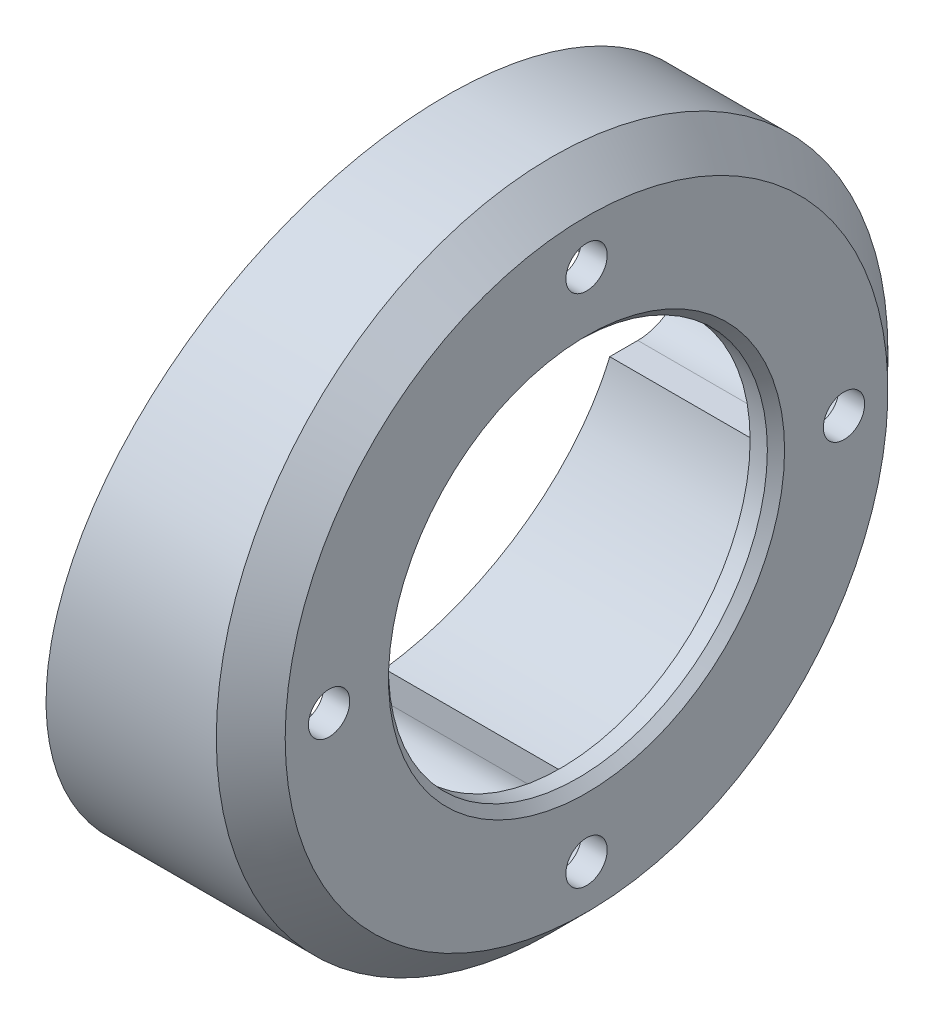
ISO-10303-21;
HEADER;
FILE_DESCRIPTION(('STEP AP214'),'2;1');
FILE_NAME('part.step','',(''),(''),'','','');
FILE_SCHEMA(('AUTOMOTIVE_DESIGN { 1 0 10303 214 1 1 1 1 }'));
ENDSEC;
DATA;
#1=APPLICATION_CONTEXT('core data for automotive mechanical design processes');
#2=APPLICATION_PROTOCOL_DEFINITION('international standard','automotive_design',2000,#1);
#3=PRODUCT_CONTEXT('',#1,'mechanical');
#4=PRODUCT('Part','Part','',(#3));
#5=PRODUCT_RELATED_PRODUCT_CATEGORY('part','',(#4));
#6=PRODUCT_DEFINITION_FORMATION('','',#4);
#7=PRODUCT_DEFINITION_CONTEXT('part definition',#1,'design');
#8=PRODUCT_DEFINITION('design','',#6,#7);
#9=PRODUCT_DEFINITION_SHAPE('','',#8);
#10=(LENGTH_UNIT() NAMED_UNIT(*) SI_UNIT(.MILLI.,.METRE.));
#11=(NAMED_UNIT(*) PLANE_ANGLE_UNIT() SI_UNIT($,.RADIAN.));
#12=(NAMED_UNIT(*) SI_UNIT($,.STERADIAN.) SOLID_ANGLE_UNIT());
#13=UNCERTAINTY_MEASURE_WITH_UNIT(LENGTH_MEASURE(1.E-05),#10,'distance_accuracy_value','');
#14=(GEOMETRIC_REPRESENTATION_CONTEXT(3) GLOBAL_UNCERTAINTY_ASSIGNED_CONTEXT((#13)) GLOBAL_UNIT_ASSIGNED_CONTEXT((#10,
#11,#12)) REPRESENTATION_CONTEXT('',''));
#15=CARTESIAN_POINT('',(0.,0.,0.));
#16=DIRECTION('',(0.,0.,1.));
#17=DIRECTION('',(1.,0.,0.));
#18=AXIS2_PLACEMENT_3D('',#15,#16,#17);
#19=CARTESIAN_POINT('',(-28.0240982862132,0.,0.));
#20=DIRECTION('',(1.,0.,0.));
#21=DIRECTION('',(0.,0.,-1.));
#22=AXIS2_PLACEMENT_3D('',#19,#20,#21);
#23=CYLINDRICAL_SURFACE('',#22,11.);
#24=CARTESIAN_POINT('',(-13.5,0.,0.));
#25=DIRECTION('',(1.,0.,0.));
#26=DIRECTION('',(0.,0.,-1.));
#27=AXIS2_PLACEMENT_3D('',#24,#25,#26);
#28=CIRCLE('',#27,11.);
#29=CARTESIAN_POINT('',(-13.5,0.,-11.));
#30=VERTEX_POINT('',#29);
#31=EDGE_CURVE('E174',#30,#30,#28,.T.);
#32=ORIENTED_EDGE('',*,*,#31,.T.);
#33=EDGE_LOOP('',(#32));
#34=FACE_BOUND('',#33,.T.);
#35=CARTESIAN_POINT('',(-14.5,0.,0.));
#36=DIRECTION('',(1.,0.,0.));
#37=DIRECTION('',(0.,0.,-1.));
#38=AXIS2_PLACEMENT_3D('',#35,#36,#37);
#39=CIRCLE('',#38,11.);
#40=CARTESIAN_POINT('',(-14.5,0.,-11.));
#41=VERTEX_POINT('',#40);
#42=EDGE_CURVE('E19',#41,#41,#39,.F.);
#43=ORIENTED_EDGE('',*,*,#42,.T.);
#44=EDGE_LOOP('',(#43));
#45=FACE_BOUND('',#44,.T.);
#46=ADVANCED_FACE('F16',(#34,#45),#23,.F.);
#47=CARTESIAN_POINT('',(-13.,0.,0.));
#48=DIRECTION('',(1.,0.,0.));
#49=DIRECTION('',(0.,0.,-1.));
#50=AXIS2_PLACEMENT_3D('',#47,#48,#49);
#51=CONICAL_SURFACE('',#50,11.5,0.785398163397452);
#52=ORIENTED_EDGE('',*,*,#31,.F.);
#53=EDGE_LOOP('',(#52));
#54=FACE_BOUND('',#53,.T.);
#55=CARTESIAN_POINT('',(-13.,0.,0.));
#56=DIRECTION('',(1.,0.,0.));
#57=DIRECTION('',(0.,0.,-1.));
#58=AXIS2_PLACEMENT_3D('',#55,#56,#57);
#59=CIRCLE('',#58,11.5);
#60=CARTESIAN_POINT('',(-13.,0.,-11.5));
#61=VERTEX_POINT('',#60);
#62=EDGE_CURVE('E263',#61,#61,#59,.F.);
#63=ORIENTED_EDGE('',*,*,#62,.F.);
#64=EDGE_LOOP('',(#63));
#65=FACE_BOUND('',#64,.T.);
#66=ADVANCED_FACE('F750',(#54,#65),#51,.F.);
#67=CARTESIAN_POINT('',(0.,-1.56592938047115E-13,14.95));
#68=DIRECTION('',(1.,0.,0.));
#69=DIRECTION('',(0.,0.,-1.));
#70=AXIS2_PLACEMENT_3D('',#67,#68,#69);
#71=CYLINDRICAL_SURFACE('',#70,1.2);
#72=CARTESIAN_POINT('',(-13.,-1.56592938047115E-13,14.95));
#73=DIRECTION('',(1.,0.,0.));
#74=DIRECTION('',(0.,0.,-1.));
#75=AXIS2_PLACEMENT_3D('',#72,#73,#74);
#76=CIRCLE('',#75,1.2);
#77=CARTESIAN_POINT('',(-13.,-1.56592938047115E-13,13.75));
#78=VERTEX_POINT('',#77);
#79=EDGE_CURVE('E260',#78,#78,#76,.F.);
#80=ORIENTED_EDGE('',*,*,#79,.F.);
#81=EDGE_LOOP('',(#80));
#82=FACE_BOUND('',#81,.T.);
#83=CARTESIAN_POINT('',(-14.5,-1.56592938047115E-13,14.95));
#84=DIRECTION('',(1.,0.,0.));
#85=DIRECTION('',(0.,0.,-1.));
#86=AXIS2_PLACEMENT_3D('',#83,#84,#85);
#87=CIRCLE('',#86,1.2);
#88=CARTESIAN_POINT('',(-14.5,-1.56592938047115E-13,13.75));
#89=VERTEX_POINT('',#88);
#90=EDGE_CURVE('E266',#89,#89,#87,.F.);
#91=ORIENTED_EDGE('',*,*,#90,.T.);
#92=EDGE_LOOP('',(#91));
#93=FACE_BOUND('',#92,.T.);
#94=ADVANCED_FACE('F741',(#82,#93),#71,.F.);
#95=CARTESIAN_POINT('',(0.,14.95,0.));
#96=DIRECTION('',(1.,0.,0.));
#97=DIRECTION('',(0.,1.,0.));
#98=AXIS2_PLACEMENT_3D('',#95,#96,#97);
#99=CYLINDRICAL_SURFACE('',#98,1.2);
#100=CARTESIAN_POINT('',(-13.,14.95,0.));
#101=DIRECTION('',(1.,0.,0.));
#102=DIRECTION('',(0.,1.,0.));
#103=AXIS2_PLACEMENT_3D('',#100,#101,#102);
#104=CIRCLE('',#103,1.2);
#105=CARTESIAN_POINT('',(-13.,16.15,0.));
#106=VERTEX_POINT('',#105);
#107=EDGE_CURVE('E257',#106,#106,#104,.F.);
#108=ORIENTED_EDGE('',*,*,#107,.F.);
#109=EDGE_LOOP('',(#108));
#110=FACE_BOUND('',#109,.T.);
#111=CARTESIAN_POINT('',(-14.5,14.95,0.));
#112=DIRECTION('',(1.,0.,0.));
#113=DIRECTION('',(0.,1.,0.));
#114=AXIS2_PLACEMENT_3D('',#111,#112,#113);
#115=CIRCLE('',#114,1.2);
#116=CARTESIAN_POINT('',(-14.5,16.15,0.));
#117=VERTEX_POINT('',#116);
#118=EDGE_CURVE('E269',#117,#117,#115,.F.);
#119=ORIENTED_EDGE('',*,*,#118,.T.);
#120=EDGE_LOOP('',(#119));
#121=FACE_BOUND('',#120,.T.);
#122=ADVANCED_FACE('F732',(#110,#121),#99,.F.);
#123=CARTESIAN_POINT('',(0.,0.,-14.95));
#124=DIRECTION('',(1.,0.,0.));
#125=DIRECTION('',(0.,0.,-1.));
#126=AXIS2_PLACEMENT_3D('',#123,#124,#125);
#127=CYLINDRICAL_SURFACE('',#126,1.2);
#128=CARTESIAN_POINT('',(-13.,0.,-14.95));
#129=DIRECTION('',(1.,0.,0.));
#130=DIRECTION('',(0.,0.,-1.));
#131=AXIS2_PLACEMENT_3D('',#128,#129,#130);
#132=CIRCLE('',#131,1.2);
#133=CARTESIAN_POINT('',(-13.,0.,-16.15));
#134=VERTEX_POINT('',#133);
#135=EDGE_CURVE('E170',#134,#134,#132,.F.);
#136=ORIENTED_EDGE('',*,*,#135,.F.);
#137=EDGE_LOOP('',(#136));
#138=FACE_BOUND('',#137,.T.);
#139=CARTESIAN_POINT('',(-14.5,0.,-14.95));
#140=DIRECTION('',(1.,0.,0.));
#141=DIRECTION('',(0.,0.,-1.));
#142=AXIS2_PLACEMENT_3D('',#139,#140,#141);
#143=CIRCLE('',#142,1.2);
#144=CARTESIAN_POINT('',(-14.5,0.,-16.15));
#145=VERTEX_POINT('',#144);
#146=EDGE_CURVE('E272',#145,#145,#143,.F.);
#147=ORIENTED_EDGE('',*,*,#146,.T.);
#148=EDGE_LOOP('',(#147));
#149=FACE_BOUND('',#148,.T.);
#150=ADVANCED_FACE('F723',(#138,#149),#127,.F.);
#151=CARTESIAN_POINT('',(0.,-14.95,0.));
#152=DIRECTION('',(1.,0.,0.));
#153=DIRECTION('',(0.,1.,0.));
#154=AXIS2_PLACEMENT_3D('',#151,#152,#153);
#155=CYLINDRICAL_SURFACE('',#154,1.2);
#156=CARTESIAN_POINT('',(-13.,-14.95,0.));
#157=DIRECTION('',(1.,0.,0.));
#158=DIRECTION('',(0.,1.,0.));
#159=AXIS2_PLACEMENT_3D('',#156,#157,#158);
#160=CIRCLE('',#159,1.2);
#161=CARTESIAN_POINT('',(-13.,-13.75,0.));
#162=VERTEX_POINT('',#161);
#163=EDGE_CURVE('E164',#162,#162,#160,.F.);
#164=ORIENTED_EDGE('',*,*,#163,.F.);
#165=EDGE_LOOP('',(#164));
#166=FACE_BOUND('',#165,.T.);
#167=CARTESIAN_POINT('',(-14.5,-14.95,0.));
#168=DIRECTION('',(1.,0.,0.));
#169=DIRECTION('',(0.,1.,0.));
#170=AXIS2_PLACEMENT_3D('',#167,#168,#169);
#171=CIRCLE('',#170,1.2);
#172=CARTESIAN_POINT('',(-14.5,-13.75,0.));
#173=VERTEX_POINT('',#172);
#174=EDGE_CURVE('E274',#173,#173,#171,.F.);
#175=ORIENTED_EDGE('',*,*,#174,.T.);
#176=EDGE_LOOP('',(#175));
#177=FACE_BOUND('',#176,.T.);
#178=ADVANCED_FACE('F157',(#166,#177),#155,.F.);
#179=CARTESIAN_POINT('',(-16.4758151388568,11.66726188958,11.66726188958));
#180=DIRECTION('',(-1.,0.,0.));
#181=DIRECTION('',(0.,0.,1.));
#182=AXIS2_PLACEMENT_3D('',#179,#180,#181);
#183=CONICAL_SURFACE('',#182,2.00000000000011,1.02974425867662);
#184=CARTESIAN_POINT('',(-15.2740939008015,11.66726188958,11.6672618895802));
#185=VERTEX_POINT('',#184);
#186=VERTEX_LOOP('',#185);
#187=FACE_BOUND('',#186,.T.);
#188=CARTESIAN_POINT('',(-16.4758151388566,11.66726188958,11.66726188958));
#189=DIRECTION('',(1.,0.,0.));
#190=DIRECTION('',(0.,0.,-1.));
#191=AXIS2_PLACEMENT_3D('',#188,#189,#190);
#192=CIRCLE('',#191,2.);
#193=CARTESIAN_POINT('',(-16.4758151388566,11.66726188958,9.66726188958));
#194=VERTEX_POINT('',#193);
#195=EDGE_CURVE('E161',#194,#194,#192,.F.);
#196=ORIENTED_EDGE('',*,*,#195,.T.);
#197=EDGE_LOOP('',(#196));
#198=FACE_BOUND('',#197,.T.);
#199=ADVANCED_FACE('F153',(#187,#198),#183,.F.);
#200=CARTESIAN_POINT('',(-17.5379964439487,5.643332364874,15.50492824297));
#201=DIRECTION('',(-1.,0.,0.));
#202=DIRECTION('',(0.,0.,1.));
#203=AXIS2_PLACEMENT_3D('',#200,#201,#202);
#204=CONICAL_SURFACE('',#203,1.99999999999999,1.02974425867661);
#205=CARTESIAN_POINT('',(-16.3362752058935,5.643332364874,15.5049282429702));
#206=VERTEX_POINT('',#205);
#207=VERTEX_LOOP('',#206);
#208=FACE_BOUND('',#207,.T.);
#209=CARTESIAN_POINT('',(-17.5379964439486,5.643332364874,15.50492824297));
#210=DIRECTION('',(1.,0.,0.));
#211=DIRECTION('',(0.,0.,-1.));
#212=AXIS2_PLACEMENT_3D('',#209,#210,#211);
#213=CIRCLE('',#212,2.);
#214=CARTESIAN_POINT('',(-17.5379964439486,5.643332364874,13.50492824297));
#215=VERTEX_POINT('',#214);
#216=EDGE_CURVE('E163',#215,#215,#213,.F.);
#217=ORIENTED_EDGE('',*,*,#216,.T.);
#218=EDGE_LOOP('',(#217));
#219=FACE_BOUND('',#218,.T.);
#220=ADVANCED_FACE('F156',(#208,#219),#204,.F.);
#221=CARTESIAN_POINT('',(-20.5903212631053,-11.66726188958,-11.66726188958));
#222=DIRECTION('',(-1.,0.,0.));
#223=DIRECTION('',(0.,0.,1.));
#224=AXIS2_PLACEMENT_3D('',#221,#222,#223);
#225=CONICAL_SURFACE('',#224,1.99999999999944,1.02974425867599);
#226=CARTESIAN_POINT('',(-19.3886000250503,-11.66726188958,-11.6672618895789));
#227=VERTEX_POINT('',#226);
#228=VERTEX_LOOP('',#227);
#229=FACE_BOUND('',#228,.T.);
#230=CARTESIAN_POINT('',(-20.5903212631058,-11.66726188958,-11.66726188958));
#231=DIRECTION('',(-1.,0.,0.));
#232=DIRECTION('',(0.,0.,1.));
#233=AXIS2_PLACEMENT_3D('',#230,#231,#232);
#234=CIRCLE('',#233,2.);
#235=CARTESIAN_POINT('',(-20.5903212631058,-11.66726188958,-9.66726188958));
#236=VERTEX_POINT('',#235);
#237=EDGE_CURVE('E167',#236,#236,#234,.T.);
#238=ORIENTED_EDGE('',*,*,#237,.T.);
#239=EDGE_LOOP('',(#238));
#240=FACE_BOUND('',#239,.T.);
#241=ADVANCED_FACE('F385',(#229,#240),#225,.F.);
#242=CARTESIAN_POINT('',(-28.0240982862132,-2.20000000000016,-14.95));
#243=DIRECTION('',(0.,1.,0.));
#244=DIRECTION('',(0.,0.,1.));
#245=AXIS2_PLACEMENT_3D('',#242,#243,#244);
#246=PLANE('',#245);
#247=DIRECTION('',(0.,0.,-1.));
#248=VECTOR('',#247,1.);
#249=CARTESIAN_POINT('',(-14.5,-2.20000000000016,0.));
#250=LINE('',#249,#248);
#251=CARTESIAN_POINT('',(-14.5,-2.20000000000016,-13.3195345264014));
#252=VERTEX_POINT('',#251);
#253=CARTESIAN_POINT('',(-14.5,-2.20000000000005,-14.95));
#254=VERTEX_POINT('',#253);
#255=EDGE_CURVE('E134',#252,#254,#250,.T.);
#256=ORIENTED_EDGE('',*,*,#255,.T.);
#257=DIRECTION('',(1.,0.,0.));
#258=VECTOR('',#257,1.);
#259=CARTESIAN_POINT('',(0.,-2.19999999999995,-14.95));
#260=LINE('',#259,#258);
#261=CARTESIAN_POINT('',(-24.9736415199568,-2.2,-14.95));
#262=VERTEX_POINT('',#261);
#263=EDGE_CURVE('E313',#254,#262,#260,.F.);
#264=ORIENTED_EDGE('',*,*,#263,.T.);
#265=DIRECTION('',(0.,0.,1.));
#266=VECTOR('',#265,1.);
#267=CARTESIAN_POINT('',(-24.9736415199568,-2.20000000000016,-14.95));
#268=LINE('',#267,#266);
#269=CARTESIAN_POINT('',(-24.9736415199568,-2.20000000000016,-13.3195345264014));
#270=VERTEX_POINT('',#269);
#271=EDGE_CURVE('E176',#262,#270,#268,.T.);
#272=ORIENTED_EDGE('',*,*,#271,.T.);
#273=DIRECTION('',(1.,0.,0.));
#274=VECTOR('',#273,1.);
#275=CARTESIAN_POINT('',(0.,-2.20000000000016,-13.3195345264014));
#276=LINE('',#275,#274);
#277=EDGE_CURVE('E362',#270,#252,#276,.T.);
#278=ORIENTED_EDGE('',*,*,#277,.T.);
#279=EDGE_LOOP('',(#256,#264,#272,#278));
#280=FACE_BOUND('',#279,.T.);
#281=ADVANCED_FACE('F383',(#280),#246,.T.);
#282=CARTESIAN_POINT('',(-28.0240982862132,-13.3195345264014,-2.2));
#283=DIRECTION('',(0.,0.,1.));
#284=DIRECTION('',(0.,-1.,0.));
#285=AXIS2_PLACEMENT_3D('',#282,#283,#284);
#286=PLANE('',#285);
#287=DIRECTION('',(0.,1.,0.));
#288=VECTOR('',#287,1.);
#289=CARTESIAN_POINT('',(-14.5,0.,-2.2));
#290=LINE('',#289,#288);
#291=CARTESIAN_POINT('',(-14.5,-14.95,-2.2));
#292=VERTEX_POINT('',#291);
#293=CARTESIAN_POINT('',(-14.5,-13.3195345264014,-2.2));
#294=VERTEX_POINT('',#293);
#295=EDGE_CURVE('E296',#292,#294,#290,.T.);
#296=ORIENTED_EDGE('',*,*,#295,.T.);
#297=DIRECTION('',(1.,0.,0.));
#298=VECTOR('',#297,1.);
#299=CARTESIAN_POINT('',(0.,-13.3195345264014,-2.2));
#300=LINE('',#299,#298);
#301=CARTESIAN_POINT('',(-26.9343154698807,-13.3195345264014,-2.2));
#302=VERTEX_POINT('',#301);
#303=EDGE_CURVE('E251',#294,#302,#300,.F.);
#304=ORIENTED_EDGE('',*,*,#303,.T.);
#305=DIRECTION('',(-0.173648177666935,-0.984807753012207,0.));
#306=VECTOR('',#305,1.);
#307=CARTESIAN_POINT('',(-26.9343154698807,-13.3195345264014,-2.2));
#308=LINE('',#307,#306);
#309=CARTESIAN_POINT('',(-27.2218105239897,-14.95,-2.2));
#310=VERTEX_POINT('',#309);
#311=EDGE_CURVE('E310',#302,#310,#308,.T.);
#312=ORIENTED_EDGE('',*,*,#311,.T.);
#313=DIRECTION('',(1.,0.,0.));
#314=VECTOR('',#313,1.);
#315=CARTESIAN_POINT('',(0.,-14.95,-2.2));
#316=LINE('',#315,#314);
#317=EDGE_CURVE('E247',#310,#292,#316,.T.);
#318=ORIENTED_EDGE('',*,*,#317,.T.);
#319=EDGE_LOOP('',(#296,#304,#312,#318));
#320=FACE_BOUND('',#319,.T.);
#321=ADVANCED_FACE('F366',(#320),#286,.T.);
#322=CARTESIAN_POINT('',(-28.0240982862132,-13.3195345264014,2.2));
#323=DIRECTION('',(0.,0.,-1.));
#324=DIRECTION('',(-1.,0.,0.));
#325=AXIS2_PLACEMENT_3D('',#322,#323,#324);
#326=PLANE('',#325);
#327=DIRECTION('',(0.,1.,0.));
#328=VECTOR('',#327,1.);
#329=CARTESIAN_POINT('',(-14.5,0.,2.2));
#330=LINE('',#329,#328);
#331=CARTESIAN_POINT('',(-14.5,-13.3195345264014,2.2));
#332=VERTEX_POINT('',#331);
#333=CARTESIAN_POINT('',(-14.5,-14.95,2.2));
#334=VERTEX_POINT('',#333);
#335=EDGE_CURVE('E298',#332,#334,#330,.F.);
#336=ORIENTED_EDGE('',*,*,#335,.T.);
#337=DIRECTION('',(1.,0.,0.));
#338=VECTOR('',#337,1.);
#339=CARTESIAN_POINT('',(0.,-14.95,2.2));
#340=LINE('',#339,#338);
#341=CARTESIAN_POINT('',(-27.2218105239897,-14.95,2.2));
#342=VERTEX_POINT('',#341);
#343=EDGE_CURVE('E359',#334,#342,#340,.F.);
#344=ORIENTED_EDGE('',*,*,#343,.T.);
#345=DIRECTION('',(0.173648177666935,0.984807753012207,0.));
#346=VECTOR('',#345,1.);
#347=CARTESIAN_POINT('',(-27.2218105239897,-14.95,2.2));
#348=LINE('',#347,#346);
#349=CARTESIAN_POINT('',(-26.9343154698807,-13.3195345264014,2.2));
#350=VERTEX_POINT('',#349);
#351=EDGE_CURVE('E308',#342,#350,#348,.T.);
#352=ORIENTED_EDGE('',*,*,#351,.T.);
#353=DIRECTION('',(1.,0.,0.));
#354=VECTOR('',#353,1.);
#355=CARTESIAN_POINT('',(0.,-13.3195345264014,2.2));
#356=LINE('',#355,#354);
#357=EDGE_CURVE('E354',#350,#332,#356,.T.);
#358=ORIENTED_EDGE('',*,*,#357,.T.);
#359=EDGE_LOOP('',(#336,#344,#352,#358));
#360=FACE_BOUND('',#359,.T.);
#361=ADVANCED_FACE('F392',(#360),#326,.T.);
#362=CARTESIAN_POINT('',(-28.0240982862132,-2.20000000000016,13.3195345264014));
#363=DIRECTION('',(0.,1.,0.));
#364=DIRECTION('',(0.,0.,1.));
#365=AXIS2_PLACEMENT_3D('',#362,#363,#364);
#366=PLANE('',#365);
#367=DIRECTION('',(0.,0.,-1.));
#368=VECTOR('',#367,1.);
#369=CARTESIAN_POINT('',(-14.5,-2.20000000000016,0.));
#370=LINE('',#369,#368);
#371=CARTESIAN_POINT('',(-14.5,-2.20000000000016,14.95));
#372=VERTEX_POINT('',#371);
#373=CARTESIAN_POINT('',(-14.5,-2.20000000000016,13.3195345264014));
#374=VERTEX_POINT('',#373);
#375=EDGE_CURVE('E279',#372,#374,#370,.T.);
#376=ORIENTED_EDGE('',*,*,#375,.T.);
#377=DIRECTION('',(1.,0.,0.));
#378=VECTOR('',#377,1.);
#379=CARTESIAN_POINT('',(0.,-2.20000000000016,13.3195345264014));
#380=LINE('',#379,#378);
#381=CARTESIAN_POINT('',(-24.9736415199568,-2.20000000000016,13.3195345264014));
#382=VERTEX_POINT('',#381);
#383=EDGE_CURVE('E243',#374,#382,#380,.F.);
#384=ORIENTED_EDGE('',*,*,#383,.T.);
#385=DIRECTION('',(0.,0.,1.));
#386=VECTOR('',#385,1.);
#387=CARTESIAN_POINT('',(-24.9736415199568,-2.20000000000016,13.3195345264014));
#388=LINE('',#387,#386);
#389=CARTESIAN_POINT('',(-24.9736415199568,-2.20000000000016,14.95));
#390=VERTEX_POINT('',#389);
#391=EDGE_CURVE('E306',#382,#390,#388,.T.);
#392=ORIENTED_EDGE('',*,*,#391,.T.);
#393=DIRECTION('',(1.,0.,0.));
#394=VECTOR('',#393,1.);
#395=CARTESIAN_POINT('',(0.,-2.20000000000016,14.95));
#396=LINE('',#395,#394);
#397=EDGE_CURVE('E239',#390,#372,#396,.T.);
#398=ORIENTED_EDGE('',*,*,#397,.T.);
#399=EDGE_LOOP('',(#376,#384,#392,#398));
#400=FACE_BOUND('',#399,.T.);
#401=ADVANCED_FACE('F493',(#400),#366,.T.);
#402=CARTESIAN_POINT('',(-28.0240982862132,2.20000000000005,13.3195345264014));
#403=DIRECTION('',(0.,-1.,0.));
#404=DIRECTION('',(0.,0.,-1.));
#405=AXIS2_PLACEMENT_3D('',#402,#403,#404);
#406=PLANE('',#405);
#407=DIRECTION('',(0.,0.,-1.));
#408=VECTOR('',#407,1.);
#409=CARTESIAN_POINT('',(-14.5,2.20000000000005,0.));
#410=LINE('',#409,#408);
#411=CARTESIAN_POINT('',(-14.5,2.20000000000005,13.3195345264014));
#412=VERTEX_POINT('',#411);
#413=CARTESIAN_POINT('',(-14.5,2.19999999999995,14.95));
#414=VERTEX_POINT('',#413);
#415=EDGE_CURVE('E282',#412,#414,#410,.F.);
#416=ORIENTED_EDGE('',*,*,#415,.T.);
#417=DIRECTION('',(1.,0.,0.));
#418=VECTOR('',#417,1.);
#419=CARTESIAN_POINT('',(0.,2.19999999999984,14.95));
#420=LINE('',#419,#418);
#421=CARTESIAN_POINT('',(-24.1978028048395,2.19999999999989,14.95));
#422=VERTEX_POINT('',#421);
#423=EDGE_CURVE('E351',#414,#422,#420,.F.);
#424=ORIENTED_EDGE('',*,*,#423,.T.);
#425=DIRECTION('',(0.,0.,-1.));
#426=VECTOR('',#425,1.);
#427=CARTESIAN_POINT('',(-24.1978028048395,2.20000000000005,13.3195345264014));
#428=LINE('',#427,#426);
#429=CARTESIAN_POINT('',(-24.1978028048395,2.20000000000005,13.3195345264014));
#430=VERTEX_POINT('',#429);
#431=EDGE_CURVE('E304',#422,#430,#428,.T.);
#432=ORIENTED_EDGE('',*,*,#431,.T.);
#433=DIRECTION('',(1.,0.,0.));
#434=VECTOR('',#433,1.);
#435=CARTESIAN_POINT('',(0.,2.20000000000005,13.3195345264014));
#436=LINE('',#435,#434);
#437=EDGE_CURVE('E345',#430,#412,#436,.T.);
#438=ORIENTED_EDGE('',*,*,#437,.T.);
#439=EDGE_LOOP('',(#416,#424,#432,#438));
#440=FACE_BOUND('',#439,.T.);
#441=ADVANCED_FACE('F489',(#440),#406,.T.);
#442=CARTESIAN_POINT('',(-28.0240982862132,14.95,2.2));
#443=DIRECTION('',(0.,0.,-1.));
#444=DIRECTION('',(-1.,0.,0.));
#445=AXIS2_PLACEMENT_3D('',#442,#443,#444);
#446=PLANE('',#445);
#447=DIRECTION('',(0.,1.,0.));
#448=VECTOR('',#447,1.);
#449=CARTESIAN_POINT('',(-14.5,0.,2.2));
#450=LINE('',#449,#448);
#451=CARTESIAN_POINT('',(-14.5,14.95,2.2));
#452=VERTEX_POINT('',#451);
#453=CARTESIAN_POINT('',(-14.5,13.3195345264014,2.2));
#454=VERTEX_POINT('',#453);
#455=EDGE_CURVE('E287',#452,#454,#450,.F.);
#456=ORIENTED_EDGE('',*,*,#455,.T.);
#457=DIRECTION('',(1.,0.,0.));
#458=VECTOR('',#457,1.);
#459=CARTESIAN_POINT('',(0.,13.3195345264014,2.2));
#460=LINE('',#459,#458);
#461=CARTESIAN_POINT('',(-22.2371288549156,13.3195345264014,2.2));
#462=VERTEX_POINT('',#461);
#463=EDGE_CURVE('E235',#454,#462,#460,.F.);
#464=ORIENTED_EDGE('',*,*,#463,.T.);
#465=DIRECTION('',(0.173648177666932,0.984807753012208,0.));
#466=VECTOR('',#465,1.);
#467=CARTESIAN_POINT('',(-22.2371288549156,13.3195345264014,2.2));
#468=LINE('',#467,#466);
#469=CARTESIAN_POINT('',(-21.9496338008066,14.95,2.2));
#470=VERTEX_POINT('',#469);
#471=EDGE_CURVE('E302',#462,#470,#468,.T.);
#472=ORIENTED_EDGE('',*,*,#471,.T.);
#473=DIRECTION('',(1.,0.,0.));
#474=VECTOR('',#473,1.);
#475=CARTESIAN_POINT('',(0.,14.95,2.2));
#476=LINE('',#475,#474);
#477=EDGE_CURVE('E231',#470,#452,#476,.T.);
#478=ORIENTED_EDGE('',*,*,#477,.T.);
#479=EDGE_LOOP('',(#456,#464,#472,#478));
#480=FACE_BOUND('',#479,.T.);
#481=ADVANCED_FACE('F485',(#480),#446,.T.);
#482=CARTESIAN_POINT('',(-28.0240982862132,14.95,-2.2));
#483=DIRECTION('',(0.,0.,1.));
#484=DIRECTION('',(1.,0.,0.));
#485=AXIS2_PLACEMENT_3D('',#482,#483,#484);
#486=PLANE('',#485);
#487=DIRECTION('',(0.,1.,0.));
#488=VECTOR('',#487,1.);
#489=CARTESIAN_POINT('',(-14.5,0.,-2.2));
#490=LINE('',#489,#488);
#491=CARTESIAN_POINT('',(-14.5,13.3195345264014,-2.2));
#492=VERTEX_POINT('',#491);
#493=CARTESIAN_POINT('',(-14.5,14.95,-2.2));
#494=VERTEX_POINT('',#493);
#495=EDGE_CURVE('E293',#492,#494,#490,.T.);
#496=ORIENTED_EDGE('',*,*,#495,.T.);
#497=DIRECTION('',(1.,0.,0.));
#498=VECTOR('',#497,1.);
#499=CARTESIAN_POINT('',(0.,14.95,-2.2));
#500=LINE('',#499,#498);
#501=CARTESIAN_POINT('',(-21.9496338008066,14.95,-2.2));
#502=VERTEX_POINT('',#501);
#503=EDGE_CURVE('E342',#494,#502,#500,.F.);
#504=ORIENTED_EDGE('',*,*,#503,.T.);
#505=DIRECTION('',(-0.173648177666932,-0.984807753012208,0.));
#506=VECTOR('',#505,1.);
#507=CARTESIAN_POINT('',(-21.9496338008066,14.95,-2.2));
#508=LINE('',#507,#506);
#509=CARTESIAN_POINT('',(-22.2371288549156,13.3195345264014,-2.2));
#510=VERTEX_POINT('',#509);
#511=EDGE_CURVE('E300',#502,#510,#508,.T.);
#512=ORIENTED_EDGE('',*,*,#511,.T.);
#513=DIRECTION('',(1.,0.,0.));
#514=VECTOR('',#513,1.);
#515=CARTESIAN_POINT('',(0.,13.3195345264014,-2.2));
#516=LINE('',#515,#514);
#517=EDGE_CURVE('E227',#510,#492,#516,.T.);
#518=ORIENTED_EDGE('',*,*,#517,.T.);
#519=EDGE_LOOP('',(#496,#504,#512,#518));
#520=FACE_BOUND('',#519,.T.);
#521=ADVANCED_FACE('F481',(#520),#486,.T.);
#522=CARTESIAN_POINT('',(-14.5,0.,0.));
#523=DIRECTION('',(1.,0.,0.));
#524=DIRECTION('',(0.,0.,-1.));
#525=AXIS2_PLACEMENT_3D('',#522,#523,#524);
#526=PLANE('',#525);
#527=ORIENTED_EDGE('',*,*,#90,.F.);
#528=EDGE_LOOP('',(#527));
#529=FACE_BOUND('',#528,.T.);
#530=ORIENTED_EDGE('',*,*,#118,.F.);
#531=EDGE_LOOP('',(#530));
#532=FACE_BOUND('',#531,.T.);
#533=ORIENTED_EDGE('',*,*,#146,.F.);
#534=EDGE_LOOP('',(#533));
#535=FACE_BOUND('',#534,.T.);
#536=ORIENTED_EDGE('',*,*,#174,.F.);
#537=EDGE_LOOP('',(#536));
#538=FACE_BOUND('',#537,.T.);
#539=ORIENTED_EDGE('',*,*,#42,.F.);
#540=EDGE_LOOP('',(#539));
#541=FACE_BOUND('',#540,.T.);
#542=ORIENTED_EDGE('',*,*,#375,.F.);
#543=CARTESIAN_POINT('',(-14.5,-1.56592938047115E-13,14.95));
#544=DIRECTION('',(1.,0.,0.));
#545=DIRECTION('',(0.,0.,-1.));
#546=AXIS2_PLACEMENT_3D('',#543,#544,#545);
#547=CIRCLE('',#546,2.2);
#548=EDGE_CURVE('E236',#372,#414,#547,.F.);
#549=ORIENTED_EDGE('',*,*,#548,.T.);
#550=ORIENTED_EDGE('',*,*,#415,.F.);
#551=CARTESIAN_POINT('',(-14.5,0.,0.));
#552=DIRECTION('',(1.,0.,0.));
#553=DIRECTION('',(0.,0.,-1.));
#554=AXIS2_PLACEMENT_3D('',#551,#552,#553);
#555=CIRCLE('',#554,13.5);
#556=EDGE_CURVE('E232',#412,#454,#555,.F.);
#557=ORIENTED_EDGE('',*,*,#556,.T.);
#558=ORIENTED_EDGE('',*,*,#455,.F.);
#559=CARTESIAN_POINT('',(-14.5,14.95,0.));
#560=DIRECTION('',(1.,0.,0.));
#561=DIRECTION('',(0.,1.,0.));
#562=AXIS2_PLACEMENT_3D('',#559,#560,#561);
#563=CIRCLE('',#562,2.2);
#564=EDGE_CURVE('E228',#452,#494,#563,.F.);
#565=ORIENTED_EDGE('',*,*,#564,.T.);
#566=ORIENTED_EDGE('',*,*,#495,.F.);
#567=CARTESIAN_POINT('',(-14.5,0.,0.));
#568=DIRECTION('',(1.,0.,0.));
#569=DIRECTION('',(0.,0.,-1.));
#570=AXIS2_PLACEMENT_3D('',#567,#568,#569);
#571=CIRCLE('',#570,13.5);
#572=CARTESIAN_POINT('',(-14.5,2.20000000000005,-13.3195345264014));
#573=VERTEX_POINT('',#572);
#574=EDGE_CURVE('E224',#492,#573,#571,.F.);
#575=ORIENTED_EDGE('',*,*,#574,.T.);
#576=DIRECTION('',(0.,0.,-1.));
#577=VECTOR('',#576,1.);
#578=CARTESIAN_POINT('',(-14.5,2.20000000000005,-14.95));
#579=LINE('',#578,#577);
#580=CARTESIAN_POINT('',(-14.5,2.20000000000005,-14.95));
#581=VERTEX_POINT('',#580);
#582=EDGE_CURVE('E127',#581,#573,#579,.F.);
#583=ORIENTED_EDGE('',*,*,#582,.F.);
#584=CARTESIAN_POINT('',(-14.5,0.,-14.95));
#585=DIRECTION('',(1.,0.,0.));
#586=DIRECTION('',(0.,0.,-1.));
#587=AXIS2_PLACEMENT_3D('',#584,#585,#586);
#588=CIRCLE('',#587,2.2);
#589=EDGE_CURVE('E252',#581,#254,#588,.F.);
#590=ORIENTED_EDGE('',*,*,#589,.T.);
#591=ORIENTED_EDGE('',*,*,#255,.F.);
#592=CARTESIAN_POINT('',(-14.5,0.,0.));
#593=DIRECTION('',(1.,0.,0.));
#594=DIRECTION('',(0.,0.,-1.));
#595=AXIS2_PLACEMENT_3D('',#592,#593,#594);
#596=CIRCLE('',#595,13.5);
#597=EDGE_CURVE('E248',#252,#294,#596,.F.);
#598=ORIENTED_EDGE('',*,*,#597,.T.);
#599=ORIENTED_EDGE('',*,*,#295,.F.);
#600=CARTESIAN_POINT('',(-14.5,-14.95,0.));
#601=DIRECTION('',(1.,0.,0.));
#602=DIRECTION('',(0.,1.,0.));
#603=AXIS2_PLACEMENT_3D('',#600,#601,#602);
#604=CIRCLE('',#603,2.2);
#605=EDGE_CURVE('E244',#292,#334,#604,.F.);
#606=ORIENTED_EDGE('',*,*,#605,.T.);
#607=ORIENTED_EDGE('',*,*,#335,.F.);
#608=CARTESIAN_POINT('',(-14.5,0.,0.));
#609=DIRECTION('',(1.,0.,0.));
#610=DIRECTION('',(0.,0.,-1.));
#611=AXIS2_PLACEMENT_3D('',#608,#609,#610);
#612=CIRCLE('',#611,13.5);
#613=EDGE_CURVE('E240',#332,#374,#612,.F.);
#614=ORIENTED_EDGE('',*,*,#613,.T.);
#615=EDGE_LOOP('',(#542,#549,#550,#557,#558,#565,#566,#575,#583,#590,#591,#598,#599,#606,#607,#614));
#616=FACE_BOUND('',#615,.T.);
#617=ADVANCED_FACE('F382',(#529,#532,#535,#538,#541,#616),#526,.F.);
#618=CARTESIAN_POINT('',(-28.0240982862132,2.20000000000005,-14.95));
#619=DIRECTION('',(0.,-1.,0.));
#620=DIRECTION('',(0.,0.,-1.));
#621=AXIS2_PLACEMENT_3D('',#618,#619,#620);
#622=PLANE('',#621);
#623=ORIENTED_EDGE('',*,*,#582,.T.);
#624=DIRECTION('',(1.,0.,0.));
#625=VECTOR('',#624,1.);
#626=CARTESIAN_POINT('',(0.,2.20000000000005,-13.3195345264014));
#627=LINE('',#626,#625);
#628=CARTESIAN_POINT('',(-24.1978028048395,2.20000000000005,-13.3195345264014));
#629=VERTEX_POINT('',#628);
#630=EDGE_CURVE('E226',#573,#629,#627,.F.);
#631=ORIENTED_EDGE('',*,*,#630,.T.);
#632=DIRECTION('',(0.,0.,-1.));
#633=VECTOR('',#632,1.);
#634=CARTESIAN_POINT('',(-24.1978028048395,2.20000000000005,-14.95));
#635=LINE('',#634,#633);
#636=CARTESIAN_POINT('',(-24.1978028048395,2.20000000000005,-14.95));
#637=VERTEX_POINT('',#636);
#638=EDGE_CURVE('E34',#629,#637,#635,.T.);
#639=ORIENTED_EDGE('',*,*,#638,.T.);
#640=DIRECTION('',(1.,0.,0.));
#641=VECTOR('',#640,1.);
#642=CARTESIAN_POINT('',(0.,2.20000000000005,-14.95));
#643=LINE('',#642,#641);
#644=EDGE_CURVE('E253',#637,#581,#643,.T.);
#645=ORIENTED_EDGE('',*,*,#644,.T.);
#646=EDGE_LOOP('',(#623,#631,#639,#645));
#647=FACE_BOUND('',#646,.T.);
#648=ADVANCED_FACE('F331',(#647),#622,.T.);
#649=CARTESIAN_POINT('',(-17.5379964439487,5.643332364874,-15.50492824297));
#650=DIRECTION('',(-1.,0.,0.));
#651=DIRECTION('',(0.,0.,1.));
#652=AXIS2_PLACEMENT_3D('',#649,#650,#651);
#653=CONICAL_SURFACE('',#652,1.99999999999999,1.02974425867661);
#654=CARTESIAN_POINT('',(-16.3362752058935,5.643332364874,-15.5049282429702));
#655=VERTEX_POINT('',#654);
#656=VERTEX_LOOP('',#655);
#657=FACE_BOUND('',#656,.T.);
#658=CARTESIAN_POINT('',(-17.5379964439486,5.643332364874,-15.50492824297));
#659=DIRECTION('',(1.,0.,0.));
#660=DIRECTION('',(0.,0.,-1.));
#661=AXIS2_PLACEMENT_3D('',#658,#659,#660);
#662=CIRCLE('',#661,2.);
#663=CARTESIAN_POINT('',(-17.5379964439486,5.643332364874,-17.50492824297));
#664=VERTEX_POINT('',#663);
#665=EDGE_CURVE('E326',#664,#664,#662,.F.);
#666=ORIENTED_EDGE('',*,*,#665,.T.);
#667=EDGE_LOOP('',(#666));
#668=FACE_BOUND('',#667,.T.);
#669=ADVANCED_FACE('F472',(#657,#668),#653,.F.);
#670=CARTESIAN_POINT('',(-16.4758151388568,11.66726188958,-11.66726188958));
#671=DIRECTION('',(-1.,0.,0.));
#672=DIRECTION('',(0.,0.,1.));
#673=AXIS2_PLACEMENT_3D('',#670,#671,#672);
#674=CONICAL_SURFACE('',#673,2.00000000000011,1.02974425867662);
#675=CARTESIAN_POINT('',(-15.2740939008015,11.66726188958,-11.6672618895802));
#676=VERTEX_POINT('',#675);
#677=VERTEX_LOOP('',#676);
#678=FACE_BOUND('',#677,.T.);
#679=CARTESIAN_POINT('',(-16.4758151388566,11.66726188958,-11.66726188958));
#680=DIRECTION('',(1.,0.,0.));
#681=DIRECTION('',(0.,0.,-1.));
#682=AXIS2_PLACEMENT_3D('',#679,#680,#681);
#683=CIRCLE('',#682,2.);
#684=CARTESIAN_POINT('',(-16.4758151388566,11.66726188958,-13.66726188958));
#685=VERTEX_POINT('',#684);
#686=EDGE_CURVE('E323',#685,#685,#683,.F.);
#687=ORIENTED_EDGE('',*,*,#686,.T.);
#688=EDGE_LOOP('',(#687));
#689=FACE_BOUND('',#688,.T.);
#690=ADVANCED_FACE('F469',(#678,#689),#674,.F.);
#691=CARTESIAN_POINT('',(-20.5903212631053,-11.66726188958,11.66726188958));
#692=DIRECTION('',(-1.,0.,0.));
#693=DIRECTION('',(0.,0.,1.));
#694=AXIS2_PLACEMENT_3D('',#691,#692,#693);
#695=CONICAL_SURFACE('',#694,1.99999999999944,1.02974425867599);
#696=CARTESIAN_POINT('',(-19.3886000250503,-11.66726188958,11.6672618895789));
#697=VERTEX_POINT('',#696);
#698=VERTEX_LOOP('',#697);
#699=FACE_BOUND('',#698,.T.);
#700=CARTESIAN_POINT('',(-20.5903212631058,-11.66726188958,11.66726188958));
#701=DIRECTION('',(-1.,0.,0.));
#702=DIRECTION('',(0.,0.,1.));
#703=AXIS2_PLACEMENT_3D('',#700,#701,#702);
#704=CIRCLE('',#703,2.);
#705=CARTESIAN_POINT('',(-20.5903212631058,-11.66726188958,13.66726188958));
#706=VERTEX_POINT('',#705);
#707=EDGE_CURVE('E223',#706,#706,#704,.T.);
#708=ORIENTED_EDGE('',*,*,#707,.T.);
#709=EDGE_LOOP('',(#708));
#710=FACE_BOUND('',#709,.T.);
#711=ADVANCED_FACE('F465',(#699,#710),#695,.F.);
#712=CARTESIAN_POINT('',(-13.,0.,0.));
#713=DIRECTION('',(1.,0.,0.));
#714=DIRECTION('',(0.,0.,-1.));
#715=AXIS2_PLACEMENT_3D('',#712,#713,#714);
#716=PLANE('',#715);
#717=ORIENTED_EDGE('',*,*,#163,.T.);
#718=EDGE_LOOP('',(#717));
#719=FACE_BOUND('',#718,.T.);
#720=ORIENTED_EDGE('',*,*,#135,.T.);
#721=EDGE_LOOP('',(#720));
#722=FACE_BOUND('',#721,.T.);
#723=ORIENTED_EDGE('',*,*,#107,.T.);
#724=EDGE_LOOP('',(#723));
#725=FACE_BOUND('',#724,.T.);
#726=ORIENTED_EDGE('',*,*,#79,.T.);
#727=EDGE_LOOP('',(#726));
#728=FACE_BOUND('',#727,.T.);
#729=ORIENTED_EDGE('',*,*,#62,.T.);
#730=EDGE_LOOP('',(#729));
#731=FACE_BOUND('',#730,.T.);
#732=CARTESIAN_POINT('',(-13.,0.,0.));
#733=DIRECTION('',(-1.,0.,0.));
#734=DIRECTION('',(0.,0.,1.));
#735=AXIS2_PLACEMENT_3D('',#732,#733,#734);
#736=CIRCLE('',#735,17.5);
#737=CARTESIAN_POINT('',(-13.,0.,17.5));
#738=VERTEX_POINT('',#737);
#739=EDGE_CURVE('E220',#738,#738,#736,.T.);
#740=ORIENTED_EDGE('',*,*,#739,.F.);
#741=EDGE_LOOP('',(#740));
#742=FACE_BOUND('',#741,.T.);
#743=ADVANCED_FACE('F461',(#719,#722,#725,#728,#731,#742),#716,.T.);
#744=CARTESIAN_POINT('',(10.0022237223284,11.66726188958,11.66726188958));
#745=DIRECTION('',(1.,0.,0.));
#746=DIRECTION('',(0.,0.,-1.));
#747=AXIS2_PLACEMENT_3D('',#744,#745,#746);
#748=CYLINDRICAL_SURFACE('',#747,2.);
#749=CARTESIAN_POINT('',(-22.5284691002736,11.66726188958,11.66726188958));
#750=DIRECTION('',(0.984807753012208,-0.173648177666931,0.));
#751=DIRECTION('',(0.173648177666931,0.984807753012208,0.));
#752=AXIS2_PLACEMENT_3D('',#749,#750,#751);
#753=ELLIPSE('',#752,2.03085322377149,2.);
#754=CARTESIAN_POINT('',(-22.1758151388566,13.66726188958,11.66726188958));
#755=VERTEX_POINT('',#754);
#756=EDGE_CURVE('E217',#755,#755,#753,.F.);
#757=ORIENTED_EDGE('',*,*,#756,.T.);
#758=EDGE_LOOP('',(#757));
#759=FACE_BOUND('',#758,.T.);
#760=ORIENTED_EDGE('',*,*,#195,.F.);
#761=EDGE_LOOP('',(#760));
#762=FACE_BOUND('',#761,.T.);
#763=ADVANCED_FACE('F457',(#759,#762),#748,.F.);
#764=CARTESIAN_POINT('',(8.89642753390569,5.643332364874,15.50492824297));
#765=DIRECTION('',(1.,0.,0.));
#766=DIRECTION('',(0.,0.,-1.));
#767=AXIS2_PLACEMENT_3D('',#764,#765,#766);
#768=CYLINDRICAL_SURFACE('',#767,2.);
#769=CARTESIAN_POINT('',(-23.5906504053656,5.643332364874,15.50492824297));
#770=DIRECTION('',(0.984807753012208,-0.173648177666931,0.));
#771=DIRECTION('',(0.173648177666931,0.984807753012208,0.));
#772=AXIS2_PLACEMENT_3D('',#769,#770,#771);
#773=ELLIPSE('',#772,2.03085322377149,2.);
#774=CARTESIAN_POINT('',(-23.2379964439486,7.643332364874,15.50492824297));
#775=VERTEX_POINT('',#774);
#776=EDGE_CURVE('E214',#775,#775,#773,.F.);
#777=ORIENTED_EDGE('',*,*,#776,.T.);
#778=EDGE_LOOP('',(#777));
#779=FACE_BOUND('',#778,.T.);
#780=ORIENTED_EDGE('',*,*,#216,.F.);
#781=EDGE_LOOP('',(#780));
#782=FACE_BOUND('',#781,.T.);
#783=ADVANCED_FACE('F453',(#779,#782),#768,.F.);
#784=CARTESIAN_POINT('',(-29.0922129235142,-11.66726188958,-11.66726188958));
#785=DIRECTION('',(-1.,0.,0.));
#786=DIRECTION('',(0.,0.,1.));
#787=AXIS2_PLACEMENT_3D('',#784,#785,#786);
#788=CYLINDRICAL_SURFACE('',#787,2.);
#789=ORIENTED_EDGE('',*,*,#237,.F.);
#790=EDGE_LOOP('',(#789));
#791=FACE_BOUND('',#790,.T.);
#792=CARTESIAN_POINT('',(-26.6429752245227,-11.66726188958,-11.66726188958));
#793=DIRECTION('',(0.984807753012208,-0.173648177666931,0.));
#794=DIRECTION('',(-0.173648177666931,-0.984807753012208,0.));
#795=AXIS2_PLACEMENT_3D('',#792,#793,#794);
#796=ELLIPSE('',#795,2.03085322377149,2.);
#797=CARTESIAN_POINT('',(-26.9956291859397,-13.66726188958,-11.66726188958));
#798=VERTEX_POINT('',#797);
#799=EDGE_CURVE('E211',#798,#798,#796,.F.);
#800=ORIENTED_EDGE('',*,*,#799,.T.);
#801=EDGE_LOOP('',(#800));
#802=FACE_BOUND('',#801,.T.);
#803=ADVANCED_FACE('F449',(#791,#802),#788,.F.);
#804=CARTESIAN_POINT('',(0.,0.,-14.95));
#805=DIRECTION('',(1.,0.,0.));
#806=DIRECTION('',(0.,0.,-1.));
#807=AXIS2_PLACEMENT_3D('',#804,#805,#806);
#808=CYLINDRICAL_SURFACE('',#807,2.2);
#809=ORIENTED_EDGE('',*,*,#644,.F.);
#810=CARTESIAN_POINT('',(-24.5857221623981,0.,-14.95));
#811=DIRECTION('',(0.984807753012208,-0.173648177666931,0.));
#812=DIRECTION('',(0.173648177666931,0.984807753012208,0.));
#813=AXIS2_PLACEMENT_3D('',#810,#811,#812);
#814=ELLIPSE('',#813,2.23393854614864,2.2);
#815=EDGE_CURVE('E208',#637,#262,#814,.F.);
#816=ORIENTED_EDGE('',*,*,#815,.T.);
#817=ORIENTED_EDGE('',*,*,#263,.F.);
#818=ORIENTED_EDGE('',*,*,#589,.F.);
#819=EDGE_LOOP('',(#809,#816,#817,#818));
#820=FACE_BOUND('',#819,.T.);
#821=ADVANCED_FACE('F446',(#820),#808,.F.);
#822=CARTESIAN_POINT('',(0.,0.,0.));
#823=DIRECTION('',(1.,0.,0.));
#824=DIRECTION('',(0.,0.,-1.));
#825=AXIS2_PLACEMENT_3D('',#822,#823,#824);
#826=CYLINDRICAL_SURFACE('',#825,13.5);
#827=CARTESIAN_POINT('',(-24.5857221623981,0.,0.));
#828=DIRECTION('',(0.984807753012208,-0.173648177666931,0.));
#829=DIRECTION('',(0.173648177666931,0.984807753012208,0.));
#830=AXIS2_PLACEMENT_3D('',#827,#828,#829);
#831=ELLIPSE('',#830,13.7082592604576,13.5);
#832=EDGE_CURVE('E205',#270,#302,#831,.F.);
#833=ORIENTED_EDGE('',*,*,#832,.T.);
#834=ORIENTED_EDGE('',*,*,#303,.F.);
#835=ORIENTED_EDGE('',*,*,#597,.F.);
#836=ORIENTED_EDGE('',*,*,#277,.F.);
#837=EDGE_LOOP('',(#833,#834,#835,#836));
#838=FACE_BOUND('',#837,.T.);
#839=ADVANCED_FACE('F373',(#838),#826,.F.);
#840=CARTESIAN_POINT('',(0.,-14.95,0.));
#841=DIRECTION('',(1.,0.,0.));
#842=DIRECTION('',(0.,1.,0.));
#843=AXIS2_PLACEMENT_3D('',#840,#841,#842);
#844=CYLINDRICAL_SURFACE('',#843,2.2);
#845=ORIENTED_EDGE('',*,*,#317,.F.);
#846=CARTESIAN_POINT('',(-27.2218105239897,-14.95,0.));
#847=DIRECTION('',(0.984807753012208,-0.173648177666931,0.));
#848=DIRECTION('',(0.173648177666931,0.984807753012208,0.));
#849=AXIS2_PLACEMENT_3D('',#846,#847,#848);
#850=ELLIPSE('',#849,2.23393854614864,2.2);
#851=EDGE_CURVE('E202',#310,#342,#850,.F.);
#852=ORIENTED_EDGE('',*,*,#851,.T.);
#853=ORIENTED_EDGE('',*,*,#343,.F.);
#854=ORIENTED_EDGE('',*,*,#605,.F.);
#855=EDGE_LOOP('',(#845,#852,#853,#854));
#856=FACE_BOUND('',#855,.T.);
#857=ADVANCED_FACE('F380',(#856),#844,.F.);
#858=CARTESIAN_POINT('',(0.,0.,0.));
#859=DIRECTION('',(1.,0.,0.));
#860=DIRECTION('',(0.,0.,-1.));
#861=AXIS2_PLACEMENT_3D('',#858,#859,#860);
#862=CYLINDRICAL_SURFACE('',#861,13.5);
#863=CARTESIAN_POINT('',(-24.5857221623981,0.,0.));
#864=DIRECTION('',(0.984807753012208,-0.173648177666931,0.));
#865=DIRECTION('',(0.173648177666931,0.984807753012208,0.));
#866=AXIS2_PLACEMENT_3D('',#863,#864,#865);
#867=ELLIPSE('',#866,13.7082592604576,13.5);
#868=EDGE_CURVE('E199',#350,#382,#867,.F.);
#869=ORIENTED_EDGE('',*,*,#868,.T.);
#870=ORIENTED_EDGE('',*,*,#383,.F.);
#871=ORIENTED_EDGE('',*,*,#613,.F.);
#872=ORIENTED_EDGE('',*,*,#357,.F.);
#873=EDGE_LOOP('',(#869,#870,#871,#872));
#874=FACE_BOUND('',#873,.T.);
#875=ADVANCED_FACE('F437',(#874),#862,.F.);
#876=CARTESIAN_POINT('',(0.,-1.56592938047115E-13,14.95));
#877=DIRECTION('',(1.,0.,0.));
#878=DIRECTION('',(0.,0.,-1.));
#879=AXIS2_PLACEMENT_3D('',#876,#877,#878);
#880=CYLINDRICAL_SURFACE('',#879,2.2);
#881=ORIENTED_EDGE('',*,*,#397,.F.);
#882=CARTESIAN_POINT('',(-24.5857221623982,-1.56592938047115E-13,14.95));
#883=DIRECTION('',(0.984807753012208,-0.173648177666931,0.));
#884=DIRECTION('',(0.173648177666931,0.984807753012208,0.));
#885=AXIS2_PLACEMENT_3D('',#882,#883,#884);
#886=ELLIPSE('',#885,2.23393854614864,2.2);
#887=EDGE_CURVE('E196',#390,#422,#886,.F.);
#888=ORIENTED_EDGE('',*,*,#887,.T.);
#889=ORIENTED_EDGE('',*,*,#423,.F.);
#890=ORIENTED_EDGE('',*,*,#548,.F.);
#891=EDGE_LOOP('',(#881,#888,#889,#890));
#892=FACE_BOUND('',#891,.T.);
#893=ADVANCED_FACE('F433',(#892),#880,.F.);
#894=CARTESIAN_POINT('',(0.,0.,0.));
#895=DIRECTION('',(1.,0.,0.));
#896=DIRECTION('',(0.,0.,-1.));
#897=AXIS2_PLACEMENT_3D('',#894,#895,#896);
#898=CYLINDRICAL_SURFACE('',#897,13.5);
#899=CARTESIAN_POINT('',(-24.5857221623981,0.,0.));
#900=DIRECTION('',(0.984807753012208,-0.173648177666931,0.));
#901=DIRECTION('',(0.173648177666931,0.984807753012208,0.));
#902=AXIS2_PLACEMENT_3D('',#899,#900,#901);
#903=ELLIPSE('',#902,13.7082592604576,13.5);
#904=EDGE_CURVE('E193',#430,#462,#903,.F.);
#905=ORIENTED_EDGE('',*,*,#904,.T.);
#906=ORIENTED_EDGE('',*,*,#463,.F.);
#907=ORIENTED_EDGE('',*,*,#556,.F.);
#908=ORIENTED_EDGE('',*,*,#437,.F.);
#909=EDGE_LOOP('',(#905,#906,#907,#908));
#910=FACE_BOUND('',#909,.T.);
#911=ADVANCED_FACE('F429',(#910),#898,.F.);
#912=CARTESIAN_POINT('',(0.,14.95,0.));
#913=DIRECTION('',(1.,0.,0.));
#914=DIRECTION('',(0.,1.,0.));
#915=AXIS2_PLACEMENT_3D('',#912,#913,#914);
#916=CYLINDRICAL_SURFACE('',#915,2.2);
#917=ORIENTED_EDGE('',*,*,#477,.F.);
#918=CARTESIAN_POINT('',(-21.9496338008066,14.95,0.));
#919=DIRECTION('',(0.984807753012208,-0.173648177666931,0.));
#920=DIRECTION('',(0.173648177666931,0.984807753012208,0.));
#921=AXIS2_PLACEMENT_3D('',#918,#919,#920);
#922=ELLIPSE('',#921,2.23393854614864,2.2);
#923=EDGE_CURVE('E190',#470,#502,#922,.F.);
#924=ORIENTED_EDGE('',*,*,#923,.T.);
#925=ORIENTED_EDGE('',*,*,#503,.F.);
#926=ORIENTED_EDGE('',*,*,#564,.F.);
#927=EDGE_LOOP('',(#917,#924,#925,#926));
#928=FACE_BOUND('',#927,.T.);
#929=ADVANCED_FACE('F426',(#928),#916,.F.);
#930=CARTESIAN_POINT('',(0.,0.,0.));
#931=DIRECTION('',(1.,0.,0.));
#932=DIRECTION('',(0.,0.,-1.));
#933=AXIS2_PLACEMENT_3D('',#930,#931,#932);
#934=CYLINDRICAL_SURFACE('',#933,13.5);
#935=ORIENTED_EDGE('',*,*,#574,.F.);
#936=ORIENTED_EDGE('',*,*,#517,.F.);
#937=CARTESIAN_POINT('',(-24.5857221623981,0.,0.));
#938=DIRECTION('',(0.984807753012208,-0.173648177666931,0.));
#939=DIRECTION('',(0.173648177666931,0.984807753012208,0.));
#940=AXIS2_PLACEMENT_3D('',#937,#938,#939);
#941=ELLIPSE('',#940,13.7082592604576,13.5);
#942=EDGE_CURVE('E187',#510,#629,#941,.F.);
#943=ORIENTED_EDGE('',*,*,#942,.T.);
#944=ORIENTED_EDGE('',*,*,#630,.F.);
#945=EDGE_LOOP('',(#935,#936,#943,#944));
#946=FACE_BOUND('',#945,.T.);
#947=ADVANCED_FACE('F335',(#946),#934,.F.);
#948=CARTESIAN_POINT('',(8.89642753390569,5.643332364874,-15.50492824297));
#949=DIRECTION('',(1.,0.,0.));
#950=DIRECTION('',(0.,0.,-1.));
#951=AXIS2_PLACEMENT_3D('',#948,#949,#950);
#952=CYLINDRICAL_SURFACE('',#951,2.);
#953=CARTESIAN_POINT('',(-23.5906504053656,5.643332364874,-15.50492824297));
#954=DIRECTION('',(0.984807753012208,-0.173648177666931,0.));
#955=DIRECTION('',(0.173648177666931,0.984807753012208,0.));
#956=AXIS2_PLACEMENT_3D('',#953,#954,#955);
#957=ELLIPSE('',#956,2.03085322377149,2.);
#958=CARTESIAN_POINT('',(-23.2379964439486,7.643332364874,-15.50492824297));
#959=VERTEX_POINT('',#958);
#960=EDGE_CURVE('E184',#959,#959,#957,.F.);
#961=ORIENTED_EDGE('',*,*,#960,.T.);
#962=EDGE_LOOP('',(#961));
#963=FACE_BOUND('',#962,.T.);
#964=ORIENTED_EDGE('',*,*,#665,.F.);
#965=EDGE_LOOP('',(#964));
#966=FACE_BOUND('',#965,.T.);
#967=ADVANCED_FACE('F419',(#963,#966),#952,.F.);
#968=CARTESIAN_POINT('',(10.0022237223284,11.66726188958,-11.66726188958));
#969=DIRECTION('',(1.,0.,0.));
#970=DIRECTION('',(0.,0.,-1.));
#971=AXIS2_PLACEMENT_3D('',#968,#969,#970);
#972=CYLINDRICAL_SURFACE('',#971,2.);
#973=CARTESIAN_POINT('',(-22.5284691002736,11.66726188958,-11.66726188958));
#974=DIRECTION('',(0.984807753012208,-0.173648177666931,0.));
#975=DIRECTION('',(0.173648177666931,0.984807753012208,0.));
#976=AXIS2_PLACEMENT_3D('',#973,#974,#975);
#977=ELLIPSE('',#976,2.03085322377149,2.);
#978=CARTESIAN_POINT('',(-22.1758151388566,13.66726188958,-11.66726188958));
#979=VERTEX_POINT('',#978);
#980=EDGE_CURVE('E181',#979,#979,#977,.F.);
#981=ORIENTED_EDGE('',*,*,#980,.T.);
#982=EDGE_LOOP('',(#981));
#983=FACE_BOUND('',#982,.T.);
#984=ORIENTED_EDGE('',*,*,#686,.F.);
#985=EDGE_LOOP('',(#984));
#986=FACE_BOUND('',#985,.T.);
#987=ADVANCED_FACE('F415',(#983,#986),#972,.F.);
#988=CARTESIAN_POINT('',(-29.0922129235142,-11.66726188958,11.66726188958));
#989=DIRECTION('',(-1.,0.,0.));
#990=DIRECTION('',(0.,0.,1.));
#991=AXIS2_PLACEMENT_3D('',#988,#989,#990);
#992=CYLINDRICAL_SURFACE('',#991,2.);
#993=ORIENTED_EDGE('',*,*,#707,.F.);
#994=EDGE_LOOP('',(#993));
#995=FACE_BOUND('',#994,.T.);
#996=CARTESIAN_POINT('',(-26.6429752245227,-11.66726188958,11.66726188958));
#997=DIRECTION('',(0.984807753012208,-0.173648177666931,0.));
#998=DIRECTION('',(-0.173648177666931,-0.984807753012208,0.));
#999=AXIS2_PLACEMENT_3D('',#996,#997,#998);
#1000=ELLIPSE('',#999,2.03085322377149,2.);
#1001=CARTESIAN_POINT('',(-26.9956291859397,-13.66726188958,11.66726188958));
#1002=VERTEX_POINT('',#1001);
#1003=EDGE_CURVE('E178',#1002,#1002,#1000,.F.);
#1004=ORIENTED_EDGE('',*,*,#1003,.T.);
#1005=EDGE_LOOP('',(#1004));
#1006=FACE_BOUND('',#1005,.T.);
#1007=ADVANCED_FACE('F411',(#995,#1006),#992,.F.);
#1008=CARTESIAN_POINT('',(-15.,0.,0.));
#1009=DIRECTION('',(-1.,0.,0.));
#1010=DIRECTION('',(0.,0.,1.));
#1011=AXIS2_PLACEMENT_3D('',#1008,#1009,#1010);
#1012=CONICAL_SURFACE('',#1011,19.5,0.785398163397447);
#1013=ORIENTED_EDGE('',*,*,#739,.T.);
#1014=EDGE_LOOP('',(#1013));
#1015=FACE_BOUND('',#1014,.T.);
#1016=CARTESIAN_POINT('',(-15.,0.,0.));
#1017=DIRECTION('',(-1.,0.,0.));
#1018=DIRECTION('',(0.,0.,1.));
#1019=AXIS2_PLACEMENT_3D('',#1016,#1017,#1018);
#1020=CIRCLE('',#1019,19.5);
#1021=CARTESIAN_POINT('',(-15.,0.,19.5));
#1022=VERTEX_POINT('',#1021);
#1023=EDGE_CURVE('E25',#1022,#1022,#1020,.T.);
#1024=ORIENTED_EDGE('',*,*,#1023,.F.);
#1025=EDGE_LOOP('',(#1024));
#1026=FACE_BOUND('',#1025,.T.);
#1027=ADVANCED_FACE('F403',(#1015,#1026),#1012,.T.);
#1028=CARTESIAN_POINT('',(-21.5,17.5,-19.5));
#1029=DIRECTION('',(0.984807753012208,-0.173648177666931,0.));
#1030=DIRECTION('',(0.173648177666931,0.984807753012208,0.));
#1031=AXIS2_PLACEMENT_3D('',#1028,#1029,#1030);
#1032=PLANE('',#1031);
#1033=ORIENTED_EDGE('',*,*,#1003,.F.);
#1034=EDGE_LOOP('',(#1033));
#1035=FACE_BOUND('',#1034,.T.);
#1036=ORIENTED_EDGE('',*,*,#980,.F.);
#1037=EDGE_LOOP('',(#1036));
#1038=FACE_BOUND('',#1037,.T.);
#1039=ORIENTED_EDGE('',*,*,#960,.F.);
#1040=EDGE_LOOP('',(#1039));
#1041=FACE_BOUND('',#1040,.T.);
#1042=ORIENTED_EDGE('',*,*,#942,.F.);
#1043=ORIENTED_EDGE('',*,*,#511,.F.);
#1044=ORIENTED_EDGE('',*,*,#923,.F.);
#1045=ORIENTED_EDGE('',*,*,#471,.F.);
#1046=ORIENTED_EDGE('',*,*,#904,.F.);
#1047=ORIENTED_EDGE('',*,*,#431,.F.);
#1048=ORIENTED_EDGE('',*,*,#887,.F.);
#1049=ORIENTED_EDGE('',*,*,#391,.F.);
#1050=ORIENTED_EDGE('',*,*,#868,.F.);
#1051=ORIENTED_EDGE('',*,*,#351,.F.);
#1052=ORIENTED_EDGE('',*,*,#851,.F.);
#1053=ORIENTED_EDGE('',*,*,#311,.F.);
#1054=ORIENTED_EDGE('',*,*,#832,.F.);
#1055=ORIENTED_EDGE('',*,*,#271,.F.);
#1056=ORIENTED_EDGE('',*,*,#815,.F.);
#1057=ORIENTED_EDGE('',*,*,#638,.F.);
#1058=EDGE_LOOP('',(#1042,#1043,#1044,#1045,#1046,#1047,#1048,#1049,#1050,#1051,#1052,#1053,
#1054,#1055,#1056,#1057));
#1059=FACE_BOUND('',#1058,.T.);
#1060=CARTESIAN_POINT('',(-24.5857221623981,0.,0.));
#1061=DIRECTION('',(0.984807753012208,-0.173648177666931,0.));
#1062=DIRECTION('',(-0.173648177666931,-0.984807753012208,0.));
#1063=AXIS2_PLACEMENT_3D('',#1060,#1061,#1062);
#1064=ELLIPSE('',#1063,19.800818931772,19.5);
#1065=CARTESIAN_POINT('',(-28.0240982862132,-19.5,0.));
#1066=VERTEX_POINT('',#1065);
#1067=EDGE_CURVE('E11',#1066,#1066,#1064,.T.);
#1068=ORIENTED_EDGE('',*,*,#1067,.F.);
#1069=EDGE_LOOP('',(#1068));
#1070=FACE_BOUND('',#1069,.T.);
#1071=ORIENTED_EDGE('',*,*,#799,.F.);
#1072=EDGE_LOOP('',(#1071));
#1073=FACE_BOUND('',#1072,.T.);
#1074=ORIENTED_EDGE('',*,*,#776,.F.);
#1075=EDGE_LOOP('',(#1074));
#1076=FACE_BOUND('',#1075,.T.);
#1077=ORIENTED_EDGE('',*,*,#756,.F.);
#1078=EDGE_LOOP('',(#1077));
#1079=FACE_BOUND('',#1078,.T.);
#1080=ADVANCED_FACE('F374',(#1035,#1038,#1041,#1059,#1070,#1073,#1076,#1079),#1032,.F.);
#1081=CARTESIAN_POINT('',(-13.,0.,0.));
#1082=DIRECTION('',(-1.,0.,0.));
#1083=DIRECTION('',(0.,0.,1.));
#1084=AXIS2_PLACEMENT_3D('',#1081,#1082,#1083);
#1085=CYLINDRICAL_SURFACE('',#1084,19.5);
#1086=ORIENTED_EDGE('',*,*,#1023,.T.);
#1087=EDGE_LOOP('',(#1086));
#1088=FACE_BOUND('',#1087,.T.);
#1089=ORIENTED_EDGE('',*,*,#1067,.T.);
#1090=EDGE_LOOP('',(#1089));
#1091=FACE_BOUND('',#1090,.T.);
#1092=ADVANCED_FACE('F396',(#1088,#1091),#1085,.T.);
#1093=CLOSED_SHELL('',(#46,#66,#94,#122,#150,#178,#199,#220,#241,#281,#321,#361,#401,#441,#481,
#521,#617,#648,#669,#690,#711,#743,#763,#783,#803,#821,#839,#857,#875,#893,#911,#929,#947,#967,
#987,#1007,#1027,#1080,#1092));
#1094=MANIFOLD_SOLID_BREP('B1',#1093);
#1095=ADVANCED_BREP_SHAPE_REPRESENTATION('',(#18,#1094),#14);
#1096=SHAPE_DEFINITION_REPRESENTATION(#9,#1095);
ENDSEC;
END-ISO-10303-21;
